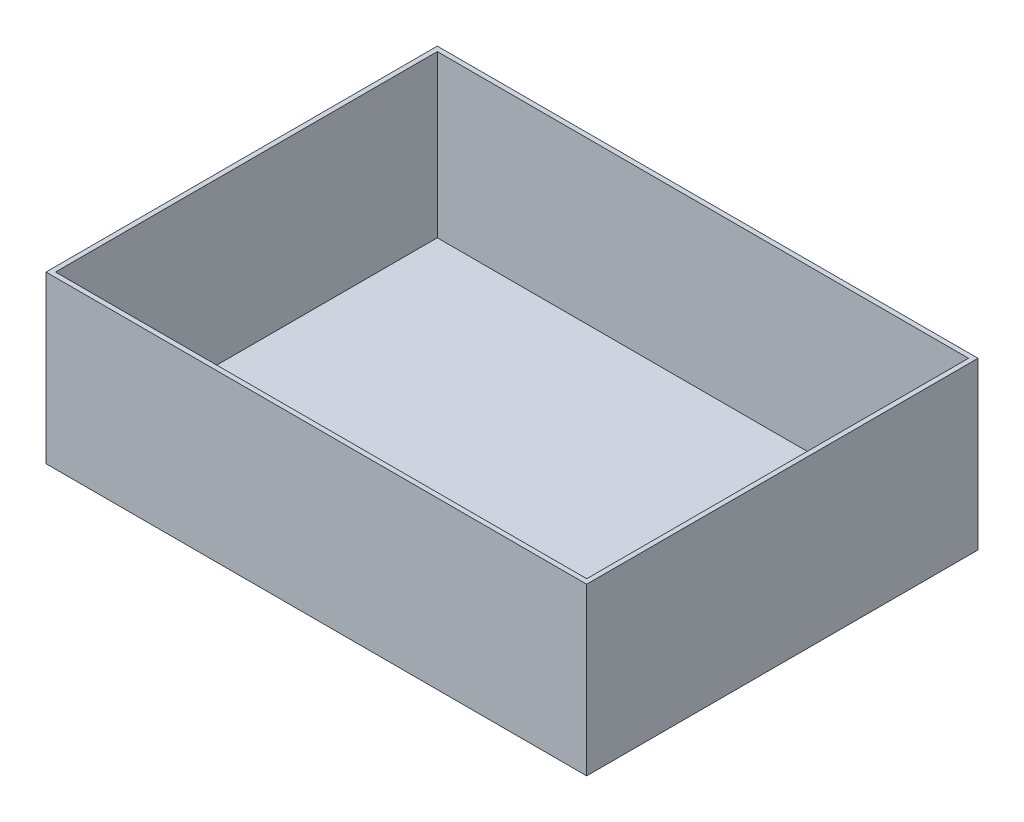
ISO-10303-21;
HEADER;
FILE_DESCRIPTION(('STEP AP214'),'2;1');
FILE_NAME('part.step','',(''),(''),'','','');
FILE_SCHEMA(('AUTOMOTIVE_DESIGN { 1 0 10303 214 1 1 1 1 }'));
ENDSEC;
DATA;
#1=APPLICATION_CONTEXT('core data for automotive mechanical design processes');
#2=APPLICATION_PROTOCOL_DEFINITION('international standard','automotive_design',2000,#1);
#3=PRODUCT_CONTEXT('',#1,'mechanical');
#4=PRODUCT('Part','Part','',(#3));
#5=PRODUCT_RELATED_PRODUCT_CATEGORY('part','',(#4));
#6=PRODUCT_DEFINITION_FORMATION('','',#4);
#7=PRODUCT_DEFINITION_CONTEXT('part definition',#1,'design');
#8=PRODUCT_DEFINITION('design','',#6,#7);
#9=PRODUCT_DEFINITION_SHAPE('','',#8);
#10=(LENGTH_UNIT() NAMED_UNIT(*) SI_UNIT(.MILLI.,.METRE.));
#11=(NAMED_UNIT(*) PLANE_ANGLE_UNIT() SI_UNIT($,.RADIAN.));
#12=(NAMED_UNIT(*) SI_UNIT($,.STERADIAN.) SOLID_ANGLE_UNIT());
#13=UNCERTAINTY_MEASURE_WITH_UNIT(LENGTH_MEASURE(1.E-05),#10,'distance_accuracy_value','');
#14=(GEOMETRIC_REPRESENTATION_CONTEXT(3) GLOBAL_UNCERTAINTY_ASSIGNED_CONTEXT((#13)) GLOBAL_UNIT_ASSIGNED_CONTEXT((#10,
#11,#12)) REPRESENTATION_CONTEXT('',''));
#15=CARTESIAN_POINT('',(0.,0.,0.));
#16=DIRECTION('',(0.,0.,1.));
#17=DIRECTION('',(1.,0.,0.));
#18=AXIS2_PLACEMENT_3D('',#15,#16,#17);
#19=CARTESIAN_POINT('',(-96.7437425506555,70.,86.7353992848629));
#20=DIRECTION('',(0.,0.,-1.));
#21=DIRECTION('',(-1.,0.,0.));
#22=AXIS2_PLACEMENT_3D('',#19,#20,#21);
#23=PLANE('',#22);
#24=DIRECTION('',(0.,-1.,0.));
#25=VECTOR('',#24,1.);
#26=CARTESIAN_POINT('',(-96.7437425506555,70.,86.7353992848629));
#27=LINE('',#26,#25);
#28=CARTESIAN_POINT('',(-96.7437425506555,70.,86.7353992848629));
#29=VERTEX_POINT('',#28);
#30=CARTESIAN_POINT('',(-96.7437425506555,0.,86.7353992848629));
#31=VERTEX_POINT('',#30);
#32=EDGE_CURVE('E78',#29,#31,#27,.T.);
#33=ORIENTED_EDGE('',*,*,#32,.T.);
#34=DIRECTION('',(1.,0.,0.));
#35=VECTOR('',#34,1.);
#36=CARTESIAN_POINT('',(-96.7437425506555,0.,86.7353992848629));
#37=LINE('',#36,#35);
#38=CARTESIAN_POINT('',(131.256257449345,0.,86.7353992848629));
#39=VERTEX_POINT('',#38);
#40=EDGE_CURVE('E141',#31,#39,#37,.T.);
#41=ORIENTED_EDGE('',*,*,#40,.T.);
#42=DIRECTION('',(0.,-1.,0.));
#43=VECTOR('',#42,1.);
#44=CARTESIAN_POINT('',(131.256257449345,70.,86.7353992848629));
#45=LINE('',#44,#43);
#46=CARTESIAN_POINT('',(131.256257449345,70.,86.7353992848629));
#47=VERTEX_POINT('',#46);
#48=EDGE_CURVE('E12',#47,#39,#45,.T.);
#49=ORIENTED_EDGE('',*,*,#48,.F.);
#50=DIRECTION('',(1.,0.,0.));
#51=VECTOR('',#50,1.);
#52=CARTESIAN_POINT('',(-96.7437425506555,70.,86.7353992848629));
#53=LINE('',#52,#51);
#54=EDGE_CURVE('E82',#29,#47,#53,.T.);
#55=ORIENTED_EDGE('',*,*,#54,.F.);
#56=EDGE_LOOP('',(#33,#41,#49,#55));
#57=FACE_BOUND('',#56,.T.);
#58=ADVANCED_FACE('F34',(#57),#23,.F.);
#59=CARTESIAN_POINT('',(131.256257449344,70.,-78.2646007151371));
#60=DIRECTION('',(1.,0.,0.));
#61=DIRECTION('',(0.,0.,-1.));
#62=AXIS2_PLACEMENT_3D('',#59,#60,#61);
#63=PLANE('',#62);
#64=ORIENTED_EDGE('',*,*,#48,.T.);
#65=DIRECTION('',(0.,0.,1.));
#66=VECTOR('',#65,1.);
#67=CARTESIAN_POINT('',(131.256257449344,0.,-78.2646007151371));
#68=LINE('',#67,#66);
#69=CARTESIAN_POINT('',(131.256257449344,0.,-78.2646007151371));
#70=VERTEX_POINT('',#69);
#71=EDGE_CURVE('E155',#70,#39,#68,.T.);
#72=ORIENTED_EDGE('',*,*,#71,.F.);
#73=DIRECTION('',(0.,-1.,0.));
#74=VECTOR('',#73,1.);
#75=CARTESIAN_POINT('',(131.256257449344,70.,-78.2646007151371));
#76=LINE('',#75,#74);
#77=CARTESIAN_POINT('',(131.256257449344,70.,-78.2646007151371));
#78=VERTEX_POINT('',#77);
#79=EDGE_CURVE('E41',#78,#70,#76,.T.);
#80=ORIENTED_EDGE('',*,*,#79,.F.);
#81=DIRECTION('',(0.,0.,1.));
#82=VECTOR('',#81,1.);
#83=CARTESIAN_POINT('',(131.256257449344,70.,-78.2646007151371));
#84=LINE('',#83,#82);
#85=EDGE_CURVE('E146',#78,#47,#84,.T.);
#86=ORIENTED_EDGE('',*,*,#85,.T.);
#87=EDGE_LOOP('',(#64,#72,#80,#86));
#88=FACE_BOUND('',#87,.T.);
#89=ADVANCED_FACE('F169',(#88),#63,.T.);
#90=CARTESIAN_POINT('',(-96.7437425506555,70.,-78.2646007151371));
#91=DIRECTION('',(0.,0.,-1.));
#92=DIRECTION('',(-1.,0.,0.));
#93=AXIS2_PLACEMENT_3D('',#90,#91,#92);
#94=PLANE('',#93);
#95=ORIENTED_EDGE('',*,*,#79,.T.);
#96=DIRECTION('',(1.,0.,0.));
#97=VECTOR('',#96,1.);
#98=CARTESIAN_POINT('',(-96.7437425506555,0.,-78.2646007151371));
#99=LINE('',#98,#97);
#100=CARTESIAN_POINT('',(-96.7437425506555,0.,-78.2646007151371));
#101=VERTEX_POINT('',#100);
#102=EDGE_CURVE('E158',#101,#70,#99,.T.);
#103=ORIENTED_EDGE('',*,*,#102,.F.);
#104=DIRECTION('',(0.,-1.,0.));
#105=VECTOR('',#104,1.);
#106=CARTESIAN_POINT('',(-96.7437425506555,70.,-78.2646007151371));
#107=LINE('',#106,#105);
#108=CARTESIAN_POINT('',(-96.7437425506555,70.,-78.2646007151371));
#109=VERTEX_POINT('',#108);
#110=EDGE_CURVE('E163',#109,#101,#107,.T.);
#111=ORIENTED_EDGE('',*,*,#110,.F.);
#112=DIRECTION('',(1.,0.,0.));
#113=VECTOR('',#112,1.);
#114=CARTESIAN_POINT('',(-96.7437425506555,70.,-78.2646007151371));
#115=LINE('',#114,#113);
#116=EDGE_CURVE('E150',#109,#78,#115,.T.);
#117=ORIENTED_EDGE('',*,*,#116,.T.);
#118=EDGE_LOOP('',(#95,#103,#111,#117));
#119=FACE_BOUND('',#118,.T.);
#120=ADVANCED_FACE('F167',(#119),#94,.T.);
#121=CARTESIAN_POINT('',(-96.7437425506555,70.,-78.2646007151371));
#122=DIRECTION('',(1.,0.,0.));
#123=DIRECTION('',(0.,0.,-1.));
#124=AXIS2_PLACEMENT_3D('',#121,#122,#123);
#125=PLANE('',#124);
#126=ORIENTED_EDGE('',*,*,#110,.T.);
#127=DIRECTION('',(0.,0.,1.));
#128=VECTOR('',#127,1.);
#129=CARTESIAN_POINT('',(-96.7437425506555,0.,-78.2646007151371));
#130=LINE('',#129,#128);
#131=EDGE_CURVE('E147',#101,#31,#130,.T.);
#132=ORIENTED_EDGE('',*,*,#131,.T.);
#133=ORIENTED_EDGE('',*,*,#32,.F.);
#134=DIRECTION('',(0.,0.,1.));
#135=VECTOR('',#134,1.);
#136=CARTESIAN_POINT('',(-96.7437425506555,70.,-78.2646007151371));
#137=LINE('',#136,#135);
#138=EDGE_CURVE('E57',#109,#29,#137,.T.);
#139=ORIENTED_EDGE('',*,*,#138,.F.);
#140=EDGE_LOOP('',(#126,#132,#133,#139));
#141=FACE_BOUND('',#140,.T.);
#142=ADVANCED_FACE('F175',(#141),#125,.F.);
#143=CARTESIAN_POINT('',(0.,70.,0.));
#144=DIRECTION('',(0.,-1.,0.));
#145=DIRECTION('',(0.,0.,-1.));
#146=AXIS2_PLACEMENT_3D('',#143,#144,#145);
#147=PLANE('',#146);
#148=DIRECTION('',(0.,0.,1.));
#149=VECTOR('',#148,1.);
#150=CARTESIAN_POINT('',(-94.7437425506555,70.,-76.2646007151371));
#151=LINE('',#150,#149);
#152=CARTESIAN_POINT('',(-94.7437425506555,70.,-76.2646007151371));
#153=VERTEX_POINT('',#152);
#154=CARTESIAN_POINT('',(-94.7437425506555,70.,84.7353992848629));
#155=VERTEX_POINT('',#154);
#156=EDGE_CURVE('E135',#153,#155,#151,.T.);
#157=ORIENTED_EDGE('',*,*,#156,.F.);
#158=DIRECTION('',(-1.,0.,0.));
#159=VECTOR('',#158,1.);
#160=CARTESIAN_POINT('',(-94.7437425506555,70.,-76.2646007151371));
#161=LINE('',#160,#159);
#162=CARTESIAN_POINT('',(129.256257449345,70.,-76.2646007151371));
#163=VERTEX_POINT('',#162);
#164=EDGE_CURVE('E48',#163,#153,#161,.T.);
#165=ORIENTED_EDGE('',*,*,#164,.F.);
#166=DIRECTION('',(0.,0.,-1.));
#167=VECTOR('',#166,1.);
#168=CARTESIAN_POINT('',(129.256257449345,70.,-76.2646007151371));
#169=LINE('',#168,#167);
#170=CARTESIAN_POINT('',(129.256257449345,70.,84.7353992848629));
#171=VERTEX_POINT('',#170);
#172=EDGE_CURVE('E126',#171,#163,#169,.T.);
#173=ORIENTED_EDGE('',*,*,#172,.F.);
#174=DIRECTION('',(1.,0.,0.));
#175=VECTOR('',#174,1.);
#176=CARTESIAN_POINT('',(-94.7437425506555,70.,84.7353992848629));
#177=LINE('',#176,#175);
#178=EDGE_CURVE('E129',#155,#171,#177,.T.);
#179=ORIENTED_EDGE('',*,*,#178,.F.);
#180=EDGE_LOOP('',(#157,#165,#173,#179));
#181=FACE_BOUND('',#180,.T.);
#182=ORIENTED_EDGE('',*,*,#54,.T.);
#183=ORIENTED_EDGE('',*,*,#85,.F.);
#184=ORIENTED_EDGE('',*,*,#116,.F.);
#185=ORIENTED_EDGE('',*,*,#138,.T.);
#186=EDGE_LOOP('',(#182,#183,#184,#185));
#187=FACE_BOUND('',#186,.T.);
#188=ADVANCED_FACE('F176',(#181,#187),#147,.F.);
#189=CARTESIAN_POINT('',(0.,0.,0.));
#190=DIRECTION('',(0.,-1.,0.));
#191=DIRECTION('',(0.,0.,-1.));
#192=AXIS2_PLACEMENT_3D('',#189,#190,#191);
#193=PLANE('',#192);
#194=ORIENTED_EDGE('',*,*,#40,.F.);
#195=ORIENTED_EDGE('',*,*,#131,.F.);
#196=ORIENTED_EDGE('',*,*,#102,.T.);
#197=ORIENTED_EDGE('',*,*,#71,.T.);
#198=EDGE_LOOP('',(#194,#195,#196,#197));
#199=FACE_BOUND('',#198,.T.);
#200=ADVANCED_FACE('F173',(#199),#193,.T.);
#201=CARTESIAN_POINT('',(-94.7437425506555,2.,-76.2646007151371));
#202=DIRECTION('',(0.,0.,-1.));
#203=DIRECTION('',(-1.,0.,0.));
#204=AXIS2_PLACEMENT_3D('',#201,#202,#203);
#205=PLANE('',#204);
#206=ORIENTED_EDGE('',*,*,#164,.T.);
#207=DIRECTION('',(0.,1.,0.));
#208=VECTOR('',#207,1.);
#209=CARTESIAN_POINT('',(-94.7437425506555,2.,-76.2646007151371));
#210=LINE('',#209,#208);
#211=CARTESIAN_POINT('',(-94.7437425506555,2.,-76.2646007151371));
#212=VERTEX_POINT('',#211);
#213=EDGE_CURVE('E104',#212,#153,#210,.T.);
#214=ORIENTED_EDGE('',*,*,#213,.F.);
#215=DIRECTION('',(-1.,0.,0.));
#216=VECTOR('',#215,1.);
#217=CARTESIAN_POINT('',(-94.7437425506555,2.,-76.2646007151371));
#218=LINE('',#217,#216);
#219=CARTESIAN_POINT('',(129.256257449345,2.,-76.2646007151371));
#220=VERTEX_POINT('',#219);
#221=EDGE_CURVE('E108',#220,#212,#218,.T.);
#222=ORIENTED_EDGE('',*,*,#221,.F.);
#223=DIRECTION('',(0.,1.,0.));
#224=VECTOR('',#223,1.);
#225=CARTESIAN_POINT('',(129.256257449345,2.,-76.2646007151371));
#226=LINE('',#225,#224);
#227=EDGE_CURVE('E139',#220,#163,#226,.T.);
#228=ORIENTED_EDGE('',*,*,#227,.T.);
#229=EDGE_LOOP('',(#206,#214,#222,#228));
#230=FACE_BOUND('',#229,.T.);
#231=ADVANCED_FACE('F106',(#230),#205,.F.);
#232=CARTESIAN_POINT('',(129.256257449345,2.,-76.2646007151371));
#233=DIRECTION('',(1.,0.,0.));
#234=DIRECTION('',(0.,0.,-1.));
#235=AXIS2_PLACEMENT_3D('',#232,#233,#234);
#236=PLANE('',#235);
#237=ORIENTED_EDGE('',*,*,#172,.T.);
#238=ORIENTED_EDGE('',*,*,#227,.F.);
#239=DIRECTION('',(0.,0.,-1.));
#240=VECTOR('',#239,1.);
#241=CARTESIAN_POINT('',(129.256257449345,2.,-76.2646007151371));
#242=LINE('',#241,#240);
#243=CARTESIAN_POINT('',(129.256257449345,2.,84.7353992848629));
#244=VERTEX_POINT('',#243);
#245=EDGE_CURVE('E114',#244,#220,#242,.T.);
#246=ORIENTED_EDGE('',*,*,#245,.F.);
#247=DIRECTION('',(0.,1.,0.));
#248=VECTOR('',#247,1.);
#249=CARTESIAN_POINT('',(129.256257449345,2.,84.7353992848629));
#250=LINE('',#249,#248);
#251=EDGE_CURVE('E142',#244,#171,#250,.T.);
#252=ORIENTED_EDGE('',*,*,#251,.T.);
#253=EDGE_LOOP('',(#237,#238,#246,#252));
#254=FACE_BOUND('',#253,.T.);
#255=ADVANCED_FACE('F215',(#254),#236,.F.);
#256=CARTESIAN_POINT('',(-94.7437425506555,2.,84.7353992848629));
#257=DIRECTION('',(0.,0.,1.));
#258=DIRECTION('',(1.,0.,0.));
#259=AXIS2_PLACEMENT_3D('',#256,#257,#258);
#260=PLANE('',#259);
#261=ORIENTED_EDGE('',*,*,#178,.T.);
#262=ORIENTED_EDGE('',*,*,#251,.F.);
#263=DIRECTION('',(1.,0.,0.));
#264=VECTOR('',#263,1.);
#265=CARTESIAN_POINT('',(-94.7437425506555,2.,84.7353992848629));
#266=LINE('',#265,#264);
#267=CARTESIAN_POINT('',(-94.7437425506555,2.,84.7353992848629));
#268=VERTEX_POINT('',#267);
#269=EDGE_CURVE('E122',#268,#244,#266,.T.);
#270=ORIENTED_EDGE('',*,*,#269,.F.);
#271=DIRECTION('',(0.,1.,0.));
#272=VECTOR('',#271,1.);
#273=CARTESIAN_POINT('',(-94.7437425506555,2.,84.7353992848629));
#274=LINE('',#273,#272);
#275=EDGE_CURVE('E113',#268,#155,#274,.T.);
#276=ORIENTED_EDGE('',*,*,#275,.T.);
#277=EDGE_LOOP('',(#261,#262,#270,#276));
#278=FACE_BOUND('',#277,.T.);
#279=ADVANCED_FACE('F223',(#278),#260,.F.);
#280=CARTESIAN_POINT('',(-94.7437425506555,2.,-76.2646007151371));
#281=DIRECTION('',(-1.,0.,0.));
#282=DIRECTION('',(0.,0.,1.));
#283=AXIS2_PLACEMENT_3D('',#280,#281,#282);
#284=PLANE('',#283);
#285=ORIENTED_EDGE('',*,*,#156,.T.);
#286=ORIENTED_EDGE('',*,*,#275,.F.);
#287=DIRECTION('',(0.,0.,1.));
#288=VECTOR('',#287,1.);
#289=CARTESIAN_POINT('',(-94.7437425506555,2.,-76.2646007151371));
#290=LINE('',#289,#288);
#291=EDGE_CURVE('E117',#212,#268,#290,.T.);
#292=ORIENTED_EDGE('',*,*,#291,.F.);
#293=ORIENTED_EDGE('',*,*,#213,.T.);
#294=EDGE_LOOP('',(#285,#286,#292,#293));
#295=FACE_BOUND('',#294,.T.);
#296=ADVANCED_FACE('F118',(#295),#284,.F.);
#297=CARTESIAN_POINT('',(0.,2.,0.));
#298=DIRECTION('',(0.,-1.,0.));
#299=DIRECTION('',(0.,0.,-1.));
#300=AXIS2_PLACEMENT_3D('',#297,#298,#299);
#301=PLANE('',#300);
#302=ORIENTED_EDGE('',*,*,#221,.T.);
#303=ORIENTED_EDGE('',*,*,#291,.T.);
#304=ORIENTED_EDGE('',*,*,#269,.T.);
#305=ORIENTED_EDGE('',*,*,#245,.T.);
#306=EDGE_LOOP('',(#302,#303,#304,#305));
#307=FACE_BOUND('',#306,.T.);
#308=ADVANCED_FACE('F124',(#307),#301,.F.);
#309=CLOSED_SHELL('',(#58,#89,#120,#142,#188,#200,#231,#255,#279,#296,#308));
#310=MANIFOLD_SOLID_BREP('B2',#309);
#311=ADVANCED_BREP_SHAPE_REPRESENTATION('',(#18,#310),#14);
#312=SHAPE_DEFINITION_REPRESENTATION(#9,#311);
ENDSEC;
END-ISO-10303-21;
